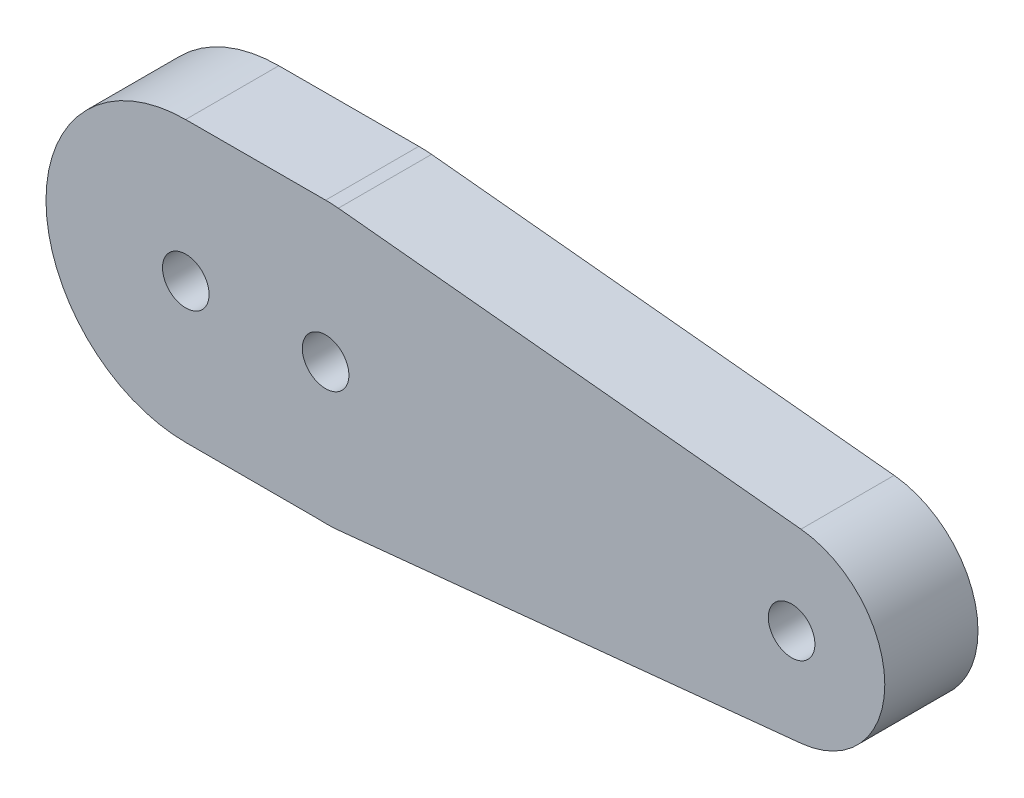
ISO-10303-21;
HEADER;
FILE_DESCRIPTION(('STEP AP214'),'2;1');
FILE_NAME('part.step','',(''),(''),'','','');
FILE_SCHEMA(('AUTOMOTIVE_DESIGN { 1 0 10303 214 1 1 1 1 }'));
ENDSEC;
DATA;
#1=APPLICATION_CONTEXT('core data for automotive mechanical design processes');
#2=APPLICATION_PROTOCOL_DEFINITION('international standard','automotive_design',2000,#1);
#3=PRODUCT_CONTEXT('',#1,'mechanical');
#4=PRODUCT('Part','Part','',(#3));
#5=PRODUCT_RELATED_PRODUCT_CATEGORY('part','',(#4));
#6=PRODUCT_DEFINITION_FORMATION('','',#4);
#7=PRODUCT_DEFINITION_CONTEXT('part definition',#1,'design');
#8=PRODUCT_DEFINITION('design','',#6,#7);
#9=PRODUCT_DEFINITION_SHAPE('','',#8);
#10=(LENGTH_UNIT() NAMED_UNIT(*) SI_UNIT(.MILLI.,.METRE.));
#11=(NAMED_UNIT(*) PLANE_ANGLE_UNIT() SI_UNIT($,.RADIAN.));
#12=(NAMED_UNIT(*) SI_UNIT($,.STERADIAN.) SOLID_ANGLE_UNIT());
#13=UNCERTAINTY_MEASURE_WITH_UNIT(LENGTH_MEASURE(1.E-05),#10,'distance_accuracy_value','');
#14=(GEOMETRIC_REPRESENTATION_CONTEXT(3) GLOBAL_UNCERTAINTY_ASSIGNED_CONTEXT((#13)) GLOBAL_UNIT_ASSIGNED_CONTEXT((#10,
#11,#12)) REPRESENTATION_CONTEXT('',''));
#15=CARTESIAN_POINT('',(0.,0.,0.));
#16=DIRECTION('',(0.,0.,1.));
#17=DIRECTION('',(1.,0.,0.));
#18=AXIS2_PLACEMENT_3D('',#15,#16,#17);
#19=CARTESIAN_POINT('',(0.,0.,5.));
#20=DIRECTION('',(0.,0.,1.));
#21=DIRECTION('',(1.,0.,0.));
#22=AXIS2_PLACEMENT_3D('',#19,#20,#21);
#23=PLANE('',#22);
#24=CARTESIAN_POINT('',(0.,0.,5.));
#25=DIRECTION('',(0.,0.,1.));
#26=DIRECTION('',(1.,0.,0.));
#27=AXIS2_PLACEMENT_3D('',#24,#25,#26);
#28=CIRCLE('',#27,2.5);
#29=CARTESIAN_POINT('',(2.5,0.,5.));
#30=VERTEX_POINT('',#29);
#31=EDGE_CURVE('E215',#30,#30,#28,.T.);
#32=ORIENTED_EDGE('',*,*,#31,.F.);
#33=EDGE_LOOP('',(#32));
#34=FACE_BOUND('',#33,.T.);
#35=CARTESIAN_POINT('',(0.,0.,5.));
#36=DIRECTION('',(0.,0.,1.));
#37=DIRECTION('',(1.,0.,0.));
#38=AXIS2_PLACEMENT_3D('',#35,#36,#37);
#39=CIRCLE('',#38,15.0209600709336);
#40=CARTESIAN_POINT('',(-0.793247409438447,-15.,5.));
#41=VERTEX_POINT('',#40);
#42=CARTESIAN_POINT('',(1.37060220936989,-14.9582984004281,5.));
#43=VERTEX_POINT('',#42);
#44=EDGE_CURVE('E166',#41,#43,#39,.T.);
#45=ORIENTED_EDGE('',*,*,#44,.T.);
#46=DIRECTION('',(0.99494650047905,0.100406479793343,0.));
#47=VECTOR('',#46,1.);
#48=CARTESIAN_POINT('',(1.37060220936989,-14.9582984004281,5.));
#49=LINE('',#48,#47);
#50=CARTESIAN_POINT('',(51.0040647979334,-9.9494650047905,5.));
#51=VERTEX_POINT('',#50);
#52=EDGE_CURVE('E102',#43,#51,#49,.T.);
#53=ORIENTED_EDGE('',*,*,#52,.T.);
#54=CARTESIAN_POINT('',(50.,0.,5.));
#55=DIRECTION('',(0.,0.,1.));
#56=DIRECTION('',(1.,0.,0.));
#57=AXIS2_PLACEMENT_3D('',#54,#55,#56);
#58=CIRCLE('',#57,10.);
#59=CARTESIAN_POINT('',(51.0040647979334,9.9494650047905,5.));
#60=VERTEX_POINT('',#59);
#61=EDGE_CURVE('E187',#51,#60,#58,.T.);
#62=ORIENTED_EDGE('',*,*,#61,.T.);
#63=DIRECTION('',(-0.99494650047905,0.100406479793343,0.));
#64=VECTOR('',#63,1.);
#65=CARTESIAN_POINT('',(1.37060220936989,14.9582984004281,5.));
#66=LINE('',#65,#64);
#67=CARTESIAN_POINT('',(1.37060220936989,14.9582984004281,5.));
#68=VERTEX_POINT('',#67);
#69=EDGE_CURVE('E201',#60,#68,#66,.T.);
#70=ORIENTED_EDGE('',*,*,#69,.T.);
#71=CARTESIAN_POINT('',(0.,0.,5.));
#72=DIRECTION('',(0.,0.,1.));
#73=DIRECTION('',(1.,0.,0.));
#74=AXIS2_PLACEMENT_3D('',#71,#72,#73);
#75=CIRCLE('',#74,15.0209600709336);
#76=CARTESIAN_POINT('',(0.,15.0209600709336,5.));
#77=VERTEX_POINT('',#76);
#78=EDGE_CURVE('E121',#68,#77,#75,.T.);
#79=ORIENTED_EDGE('',*,*,#78,.T.);
#80=DIRECTION('',(-0.999999025086406,-0.00139636178636015,0.));
#81=VECTOR('',#80,1.);
#82=CARTESIAN_POINT('',(-15.0209454267954,14.9999853762961,5.));
#83=LINE('',#82,#81);
#84=CARTESIAN_POINT('',(-15.0209454267954,14.9999853762961,5.));
#85=VERTEX_POINT('',#84);
#86=EDGE_CURVE('E115',#77,#85,#83,.T.);
#87=ORIENTED_EDGE('',*,*,#86,.T.);
#88=CARTESIAN_POINT('',(-15.,0.,5.));
#89=DIRECTION('',(0.,0.,1.));
#90=DIRECTION('',(1.,0.,0.));
#91=AXIS2_PLACEMENT_3D('',#88,#89,#90);
#92=CIRCLE('',#91,15.);
#93=CARTESIAN_POINT('',(-15.,-15.,5.));
#94=VERTEX_POINT('',#93);
#95=EDGE_CURVE('E119',#85,#94,#92,.T.);
#96=ORIENTED_EDGE('',*,*,#95,.T.);
#97=DIRECTION('',(1.,0.,0.));
#98=VECTOR('',#97,1.);
#99=CARTESIAN_POINT('',(-15.,-15.,5.));
#100=LINE('',#99,#98);
#101=EDGE_CURVE('E59',#94,#41,#100,.T.);
#102=ORIENTED_EDGE('',*,*,#101,.T.);
#103=EDGE_LOOP('',(#45,#53,#62,#70,#79,#87,#96,#102));
#104=FACE_BOUND('',#103,.T.);
#105=CARTESIAN_POINT('',(-15.,0.,5.));
#106=DIRECTION('',(0.,0.,1.));
#107=DIRECTION('',(1.,0.,0.));
#108=AXIS2_PLACEMENT_3D('',#105,#106,#107);
#109=CIRCLE('',#108,2.5);
#110=CARTESIAN_POINT('',(-12.5,0.,5.));
#111=VERTEX_POINT('',#110);
#112=EDGE_CURVE('E148',#111,#111,#109,.T.);
#113=ORIENTED_EDGE('',*,*,#112,.F.);
#114=EDGE_LOOP('',(#113));
#115=FACE_BOUND('',#114,.T.);
#116=CARTESIAN_POINT('',(50.,0.,5.));
#117=DIRECTION('',(0.,0.,1.));
#118=DIRECTION('',(1.,0.,0.));
#119=AXIS2_PLACEMENT_3D('',#116,#117,#118);
#120=CIRCLE('',#119,2.5);
#121=CARTESIAN_POINT('',(52.5,0.,5.));
#122=VERTEX_POINT('',#121);
#123=EDGE_CURVE('E223',#122,#122,#120,.T.);
#124=ORIENTED_EDGE('',*,*,#123,.F.);
#125=EDGE_LOOP('',(#124));
#126=FACE_BOUND('',#125,.T.);
#127=ADVANCED_FACE('F41',(#34,#104,#115,#126),#23,.T.);
#128=CARTESIAN_POINT('',(0.,0.,-5.));
#129=DIRECTION('',(0.,0.,1.));
#130=DIRECTION('',(1.,0.,0.));
#131=AXIS2_PLACEMENT_3D('',#128,#129,#130);
#132=PLANE('',#131);
#133=CARTESIAN_POINT('',(0.,0.,-5.));
#134=DIRECTION('',(0.,0.,1.));
#135=DIRECTION('',(1.,0.,0.));
#136=AXIS2_PLACEMENT_3D('',#133,#134,#135);
#137=CIRCLE('',#136,15.0209600709336);
#138=CARTESIAN_POINT('',(-0.793247409438447,-15.,-5.));
#139=VERTEX_POINT('',#138);
#140=CARTESIAN_POINT('',(1.37060220936989,-14.9582984004281,-5.));
#141=VERTEX_POINT('',#140);
#142=EDGE_CURVE('E143',#139,#141,#137,.T.);
#143=ORIENTED_EDGE('',*,*,#142,.F.);
#144=DIRECTION('',(1.,0.,0.));
#145=VECTOR('',#144,1.);
#146=CARTESIAN_POINT('',(-15.,-15.,-5.));
#147=LINE('',#146,#145);
#148=CARTESIAN_POINT('',(-15.,-15.,-5.));
#149=VERTEX_POINT('',#148);
#150=EDGE_CURVE('E94',#149,#139,#147,.T.);
#151=ORIENTED_EDGE('',*,*,#150,.F.);
#152=CARTESIAN_POINT('',(-15.,0.,-5.));
#153=DIRECTION('',(0.,0.,1.));
#154=DIRECTION('',(1.,0.,0.));
#155=AXIS2_PLACEMENT_3D('',#152,#153,#154);
#156=CIRCLE('',#155,15.);
#157=CARTESIAN_POINT('',(-15.0209454267954,14.9999853762961,-5.));
#158=VERTEX_POINT('',#157);
#159=EDGE_CURVE('E88',#158,#149,#156,.T.);
#160=ORIENTED_EDGE('',*,*,#159,.F.);
#161=DIRECTION('',(-0.999999025086406,-0.00139636178636015,0.));
#162=VECTOR('',#161,1.);
#163=CARTESIAN_POINT('',(-15.0209454267954,14.9999853762961,-5.));
#164=LINE('',#163,#162);
#165=CARTESIAN_POINT('',(0.,15.0209600709336,-5.));
#166=VERTEX_POINT('',#165);
#167=EDGE_CURVE('E130',#166,#158,#164,.T.);
#168=ORIENTED_EDGE('',*,*,#167,.F.);
#169=CARTESIAN_POINT('',(0.,0.,-5.));
#170=DIRECTION('',(0.,0.,1.));
#171=DIRECTION('',(1.,0.,0.));
#172=AXIS2_PLACEMENT_3D('',#169,#170,#171);
#173=CIRCLE('',#172,15.0209600709336);
#174=CARTESIAN_POINT('',(1.37060220936989,14.9582984004281,-5.));
#175=VERTEX_POINT('',#174);
#176=EDGE_CURVE('E157',#175,#166,#173,.T.);
#177=ORIENTED_EDGE('',*,*,#176,.F.);
#178=DIRECTION('',(-0.99494650047905,0.100406479793343,0.));
#179=VECTOR('',#178,1.);
#180=CARTESIAN_POINT('',(1.37060220936989,14.9582984004281,-5.));
#181=LINE('',#180,#179);
#182=CARTESIAN_POINT('',(51.0040647979334,9.9494650047905,-5.));
#183=VERTEX_POINT('',#182);
#184=EDGE_CURVE('E154',#183,#175,#181,.T.);
#185=ORIENTED_EDGE('',*,*,#184,.F.);
#186=CARTESIAN_POINT('',(50.,0.,-5.));
#187=DIRECTION('',(0.,0.,1.));
#188=DIRECTION('',(1.,0.,0.));
#189=AXIS2_PLACEMENT_3D('',#186,#187,#188);
#190=CIRCLE('',#189,10.);
#191=CARTESIAN_POINT('',(51.0040647979334,-9.9494650047905,-5.));
#192=VERTEX_POINT('',#191);
#193=EDGE_CURVE('E151',#192,#183,#190,.T.);
#194=ORIENTED_EDGE('',*,*,#193,.F.);
#195=DIRECTION('',(0.99494650047905,0.100406479793343,0.));
#196=VECTOR('',#195,1.);
#197=CARTESIAN_POINT('',(1.37060220936989,-14.9582984004281,-5.));
#198=LINE('',#197,#196);
#199=EDGE_CURVE('E147',#141,#192,#198,.T.);
#200=ORIENTED_EDGE('',*,*,#199,.F.);
#201=EDGE_LOOP('',(#143,#151,#160,#168,#177,#185,#194,#200));
#202=FACE_BOUND('',#201,.T.);
#203=CARTESIAN_POINT('',(-15.,0.,-5.));
#204=DIRECTION('',(0.,0.,1.));
#205=DIRECTION('',(1.,0.,0.));
#206=AXIS2_PLACEMENT_3D('',#203,#204,#205);
#207=CIRCLE('',#206,2.5);
#208=CARTESIAN_POINT('',(-12.5,0.,-5.));
#209=VERTEX_POINT('',#208);
#210=EDGE_CURVE('E211',#209,#209,#207,.T.);
#211=ORIENTED_EDGE('',*,*,#210,.T.);
#212=EDGE_LOOP('',(#211));
#213=FACE_BOUND('',#212,.T.);
#214=CARTESIAN_POINT('',(0.,0.,-5.));
#215=DIRECTION('',(0.,0.,1.));
#216=DIRECTION('',(1.,0.,0.));
#217=AXIS2_PLACEMENT_3D('',#214,#215,#216);
#218=CIRCLE('',#217,2.5);
#219=CARTESIAN_POINT('',(2.5,0.,-5.));
#220=VERTEX_POINT('',#219);
#221=EDGE_CURVE('E219',#220,#220,#218,.T.);
#222=ORIENTED_EDGE('',*,*,#221,.T.);
#223=EDGE_LOOP('',(#222));
#224=FACE_BOUND('',#223,.T.);
#225=CARTESIAN_POINT('',(50.,0.,-5.));
#226=DIRECTION('',(0.,0.,1.));
#227=DIRECTION('',(1.,0.,0.));
#228=AXIS2_PLACEMENT_3D('',#225,#226,#227);
#229=CIRCLE('',#228,2.5);
#230=CARTESIAN_POINT('',(52.5,0.,-5.));
#231=VERTEX_POINT('',#230);
#232=EDGE_CURVE('E227',#231,#231,#229,.T.);
#233=ORIENTED_EDGE('',*,*,#232,.T.);
#234=EDGE_LOOP('',(#233));
#235=FACE_BOUND('',#234,.T.);
#236=ADVANCED_FACE('F191',(#202,#213,#224,#235),#132,.F.);
#237=CARTESIAN_POINT('',(0.,0.,5.));
#238=DIRECTION('',(0.,0.,-1.));
#239=DIRECTION('',(-1.,0.,0.));
#240=AXIS2_PLACEMENT_3D('',#237,#238,#239);
#241=CYLINDRICAL_SURFACE('',#240,15.0209600709336);
#242=ORIENTED_EDGE('',*,*,#142,.T.);
#243=DIRECTION('',(0.,0.,-1.));
#244=VECTOR('',#243,1.);
#245=CARTESIAN_POINT('',(1.37060220936989,-14.9582984004281,5.));
#246=LINE('',#245,#244);
#247=EDGE_CURVE('E11',#43,#141,#246,.T.);
#248=ORIENTED_EDGE('',*,*,#247,.F.);
#249=ORIENTED_EDGE('',*,*,#44,.F.);
#250=DIRECTION('',(0.,0.,-1.));
#251=VECTOR('',#250,1.);
#252=CARTESIAN_POINT('',(-0.793247409438447,-15.,5.));
#253=LINE('',#252,#251);
#254=EDGE_CURVE('E139',#41,#139,#253,.T.);
#255=ORIENTED_EDGE('',*,*,#254,.T.);
#256=EDGE_LOOP('',(#242,#248,#249,#255));
#257=FACE_BOUND('',#256,.T.);
#258=ADVANCED_FACE('F43',(#257),#241,.T.);
#259=CARTESIAN_POINT('',(1.37060220936989,-14.9582984004281,5.));
#260=DIRECTION('',(-0.100406479793343,0.99494650047905,0.));
#261=DIRECTION('',(-0.99494650047905,-0.100406479793343,0.));
#262=AXIS2_PLACEMENT_3D('',#259,#260,#261);
#263=PLANE('',#262);
#264=ORIENTED_EDGE('',*,*,#199,.T.);
#265=DIRECTION('',(0.,0.,-1.));
#266=VECTOR('',#265,1.);
#267=CARTESIAN_POINT('',(51.0040647979334,-9.9494650047905,5.));
#268=LINE('',#267,#266);
#269=EDGE_CURVE('E51',#51,#192,#268,.T.);
#270=ORIENTED_EDGE('',*,*,#269,.F.);
#271=ORIENTED_EDGE('',*,*,#52,.F.);
#272=ORIENTED_EDGE('',*,*,#247,.T.);
#273=EDGE_LOOP('',(#264,#270,#271,#272));
#274=FACE_BOUND('',#273,.T.);
#275=ADVANCED_FACE('F262',(#274),#263,.F.);
#276=CARTESIAN_POINT('',(50.,0.,5.));
#277=DIRECTION('',(0.,0.,-1.));
#278=DIRECTION('',(-1.,0.,0.));
#279=AXIS2_PLACEMENT_3D('',#276,#277,#278);
#280=CYLINDRICAL_SURFACE('',#279,10.);
#281=ORIENTED_EDGE('',*,*,#193,.T.);
#282=DIRECTION('',(0.,0.,-1.));
#283=VECTOR('',#282,1.);
#284=CARTESIAN_POINT('',(51.0040647979334,9.9494650047905,5.));
#285=LINE('',#284,#283);
#286=EDGE_CURVE('E177',#60,#183,#285,.T.);
#287=ORIENTED_EDGE('',*,*,#286,.F.);
#288=ORIENTED_EDGE('',*,*,#61,.F.);
#289=ORIENTED_EDGE('',*,*,#269,.T.);
#290=EDGE_LOOP('',(#281,#287,#288,#289));
#291=FACE_BOUND('',#290,.T.);
#292=ADVANCED_FACE('F185',(#291),#280,.T.);
#293=CARTESIAN_POINT('',(1.37060220936989,14.9582984004281,5.));
#294=DIRECTION('',(-0.100406479793343,-0.99494650047905,0.));
#295=DIRECTION('',(0.99494650047905,-0.100406479793343,0.));
#296=AXIS2_PLACEMENT_3D('',#293,#294,#295);
#297=PLANE('',#296);
#298=ORIENTED_EDGE('',*,*,#184,.T.);
#299=DIRECTION('',(0.,0.,-1.));
#300=VECTOR('',#299,1.);
#301=CARTESIAN_POINT('',(1.37060220936989,14.9582984004281,5.));
#302=LINE('',#301,#300);
#303=EDGE_CURVE('E173',#68,#175,#302,.T.);
#304=ORIENTED_EDGE('',*,*,#303,.F.);
#305=ORIENTED_EDGE('',*,*,#69,.F.);
#306=ORIENTED_EDGE('',*,*,#286,.T.);
#307=EDGE_LOOP('',(#298,#304,#305,#306));
#308=FACE_BOUND('',#307,.T.);
#309=ADVANCED_FACE('F196',(#308),#297,.F.);
#310=CARTESIAN_POINT('',(0.,0.,5.));
#311=DIRECTION('',(0.,0.,-1.));
#312=DIRECTION('',(-1.,0.,0.));
#313=AXIS2_PLACEMENT_3D('',#310,#311,#312);
#314=CYLINDRICAL_SURFACE('',#313,15.0209600709336);
#315=ORIENTED_EDGE('',*,*,#176,.T.);
#316=DIRECTION('',(0.,0.,-1.));
#317=VECTOR('',#316,1.);
#318=CARTESIAN_POINT('',(0.,15.0209600709336,5.));
#319=LINE('',#318,#317);
#320=EDGE_CURVE('E132',#77,#166,#319,.T.);
#321=ORIENTED_EDGE('',*,*,#320,.F.);
#322=ORIENTED_EDGE('',*,*,#78,.F.);
#323=ORIENTED_EDGE('',*,*,#303,.T.);
#324=EDGE_LOOP('',(#315,#321,#322,#323));
#325=FACE_BOUND('',#324,.T.);
#326=ADVANCED_FACE('F199',(#325),#314,.T.);
#327=CARTESIAN_POINT('',(-15.0209454267954,14.9999853762961,5.));
#328=DIRECTION('',(0.00139636178636015,-0.999999025086406,0.));
#329=DIRECTION('',(0.999999025086406,0.00139636178636015,0.));
#330=AXIS2_PLACEMENT_3D('',#327,#328,#329);
#331=PLANE('',#330);
#332=ORIENTED_EDGE('',*,*,#167,.T.);
#333=DIRECTION('',(0.,0.,-1.));
#334=VECTOR('',#333,1.);
#335=CARTESIAN_POINT('',(-15.0209454267954,14.9999853762961,5.));
#336=LINE('',#335,#334);
#337=EDGE_CURVE('E127',#85,#158,#336,.T.);
#338=ORIENTED_EDGE('',*,*,#337,.F.);
#339=ORIENTED_EDGE('',*,*,#86,.F.);
#340=ORIENTED_EDGE('',*,*,#320,.T.);
#341=EDGE_LOOP('',(#332,#338,#339,#340));
#342=FACE_BOUND('',#341,.T.);
#343=ADVANCED_FACE('F128',(#342),#331,.F.);
#344=CARTESIAN_POINT('',(-15.,0.,5.));
#345=DIRECTION('',(0.,0.,-1.));
#346=DIRECTION('',(-1.,0.,0.));
#347=AXIS2_PLACEMENT_3D('',#344,#345,#346);
#348=CYLINDRICAL_SURFACE('',#347,15.);
#349=ORIENTED_EDGE('',*,*,#159,.T.);
#350=DIRECTION('',(0.,0.,-1.));
#351=VECTOR('',#350,1.);
#352=CARTESIAN_POINT('',(-15.,-15.,5.));
#353=LINE('',#352,#351);
#354=EDGE_CURVE('E133',#94,#149,#353,.T.);
#355=ORIENTED_EDGE('',*,*,#354,.F.);
#356=ORIENTED_EDGE('',*,*,#95,.F.);
#357=ORIENTED_EDGE('',*,*,#337,.T.);
#358=EDGE_LOOP('',(#349,#355,#356,#357));
#359=FACE_BOUND('',#358,.T.);
#360=ADVANCED_FACE('F135',(#359),#348,.T.);
#361=CARTESIAN_POINT('',(-15.,-15.,5.));
#362=DIRECTION('',(0.,1.,0.));
#363=DIRECTION('',(0.,0.,1.));
#364=AXIS2_PLACEMENT_3D('',#361,#362,#363);
#365=PLANE('',#364);
#366=ORIENTED_EDGE('',*,*,#150,.T.);
#367=ORIENTED_EDGE('',*,*,#254,.F.);
#368=ORIENTED_EDGE('',*,*,#101,.F.);
#369=ORIENTED_EDGE('',*,*,#354,.T.);
#370=EDGE_LOOP('',(#366,#367,#368,#369));
#371=FACE_BOUND('',#370,.T.);
#372=ADVANCED_FACE('F250',(#371),#365,.F.);
#373=CARTESIAN_POINT('',(-15.,0.,5.));
#374=DIRECTION('',(0.,0.,-1.));
#375=DIRECTION('',(-1.,0.,0.));
#376=AXIS2_PLACEMENT_3D('',#373,#374,#375);
#377=CYLINDRICAL_SURFACE('',#376,2.5);
#378=ORIENTED_EDGE('',*,*,#112,.T.);
#379=EDGE_LOOP('',(#378));
#380=FACE_BOUND('',#379,.T.);
#381=ORIENTED_EDGE('',*,*,#210,.F.);
#382=EDGE_LOOP('',(#381));
#383=FACE_BOUND('',#382,.T.);
#384=ADVANCED_FACE('F247',(#380,#383),#377,.F.);
#385=CARTESIAN_POINT('',(0.,0.,5.));
#386=DIRECTION('',(0.,0.,-1.));
#387=DIRECTION('',(-1.,0.,0.));
#388=AXIS2_PLACEMENT_3D('',#385,#386,#387);
#389=CYLINDRICAL_SURFACE('',#388,2.5);
#390=ORIENTED_EDGE('',*,*,#31,.T.);
#391=EDGE_LOOP('',(#390));
#392=FACE_BOUND('',#391,.T.);
#393=ORIENTED_EDGE('',*,*,#221,.F.);
#394=EDGE_LOOP('',(#393));
#395=FACE_BOUND('',#394,.T.);
#396=ADVANCED_FACE('F326',(#392,#395),#389,.F.);
#397=CARTESIAN_POINT('',(50.,0.,5.));
#398=DIRECTION('',(0.,0.,-1.));
#399=DIRECTION('',(-1.,0.,0.));
#400=AXIS2_PLACEMENT_3D('',#397,#398,#399);
#401=CYLINDRICAL_SURFACE('',#400,2.5);
#402=ORIENTED_EDGE('',*,*,#123,.T.);
#403=EDGE_LOOP('',(#402));
#404=FACE_BOUND('',#403,.T.);
#405=ORIENTED_EDGE('',*,*,#232,.F.);
#406=EDGE_LOOP('',(#405));
#407=FACE_BOUND('',#406,.T.);
#408=ADVANCED_FACE('F235',(#404,#407),#401,.F.);
#409=CLOSED_SHELL('',(#127,#236,#258,#275,#292,#309,#326,#343,#360,#372,#384,#396,#408));
#410=MANIFOLD_SOLID_BREP('B2',#409);
#411=ADVANCED_BREP_SHAPE_REPRESENTATION('',(#18,#410),#14);
#412=SHAPE_DEFINITION_REPRESENTATION(#9,#411);
ENDSEC;
END-ISO-10303-21;
